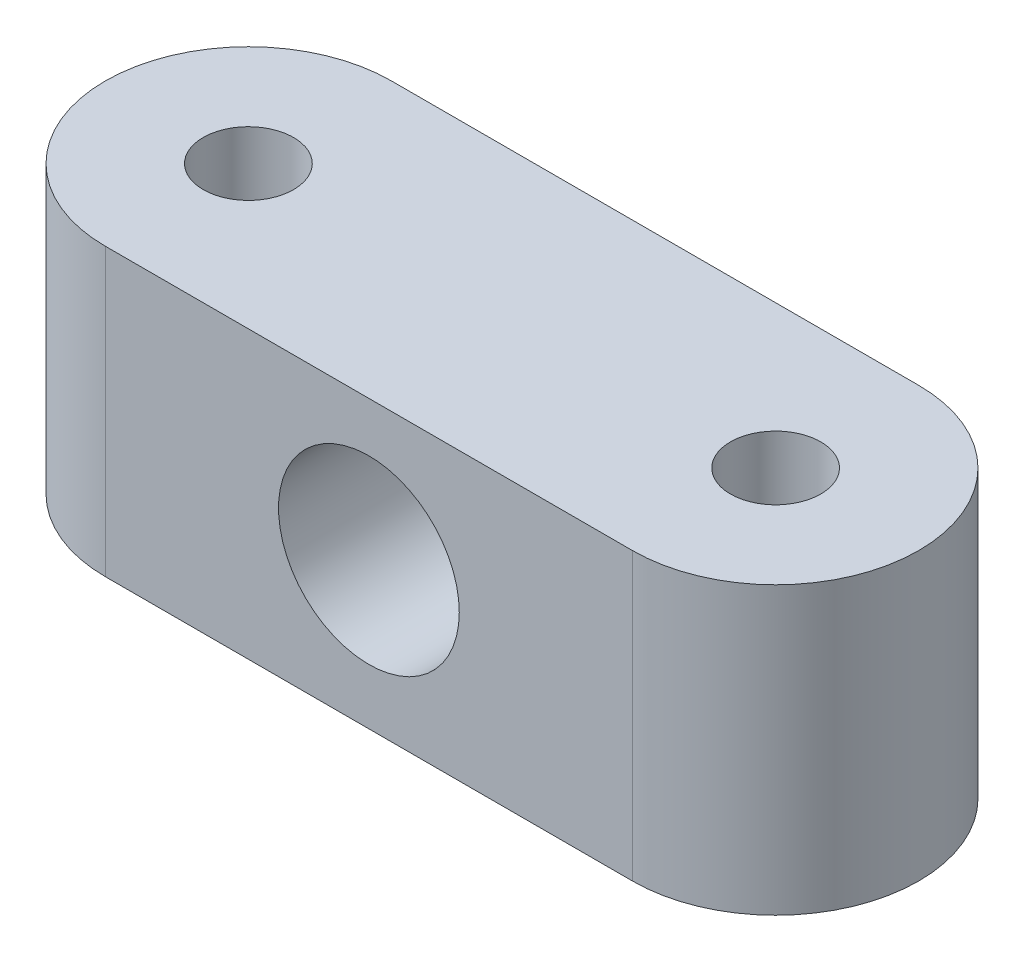
ISO-10303-21;
HEADER;
FILE_DESCRIPTION(('STEP AP214'),'2;1');
FILE_NAME('part.step','',(''),(''),'','','');
FILE_SCHEMA(('AUTOMOTIVE_DESIGN { 1 0 10303 214 1 1 1 1 }'));
ENDSEC;
DATA;
#1=APPLICATION_CONTEXT('core data for automotive mechanical design processes');
#2=APPLICATION_PROTOCOL_DEFINITION('international standard','automotive_design',2000,#1);
#3=PRODUCT_CONTEXT('',#1,'mechanical');
#4=PRODUCT('Part','Part','',(#3));
#5=PRODUCT_RELATED_PRODUCT_CATEGORY('part','',(#4));
#6=PRODUCT_DEFINITION_FORMATION('','',#4);
#7=PRODUCT_DEFINITION_CONTEXT('part definition',#1,'design');
#8=PRODUCT_DEFINITION('design','',#6,#7);
#9=PRODUCT_DEFINITION_SHAPE('','',#8);
#10=(LENGTH_UNIT() NAMED_UNIT(*) SI_UNIT(.MILLI.,.METRE.));
#11=(NAMED_UNIT(*) PLANE_ANGLE_UNIT() SI_UNIT($,.RADIAN.));
#12=(NAMED_UNIT(*) SI_UNIT($,.STERADIAN.) SOLID_ANGLE_UNIT());
#13=UNCERTAINTY_MEASURE_WITH_UNIT(LENGTH_MEASURE(1.E-05),#10,'distance_accuracy_value','');
#14=(GEOMETRIC_REPRESENTATION_CONTEXT(3) GLOBAL_UNCERTAINTY_ASSIGNED_CONTEXT((#13)) GLOBAL_UNIT_ASSIGNED_CONTEXT((#10,
#11,#12)) REPRESENTATION_CONTEXT('',''));
#15=CARTESIAN_POINT('',(0.,0.,0.));
#16=DIRECTION('',(0.,0.,1.));
#17=DIRECTION('',(1.,0.,0.));
#18=AXIS2_PLACEMENT_3D('',#15,#16,#17);
#19=CARTESIAN_POINT('',(0.,38.,0.));
#20=DIRECTION('',(0.,1.,0.));
#21=DIRECTION('',(0.,0.,1.));
#22=AXIS2_PLACEMENT_3D('',#19,#20,#21);
#23=PLANE('',#22);
#24=CARTESIAN_POINT('',(70.,38.,0.));
#25=DIRECTION('',(0.,1.,0.));
#26=DIRECTION('',(0.,0.,1.));
#27=AXIS2_PLACEMENT_3D('',#24,#25,#26);
#28=CIRCLE('',#27,6.);
#29=CARTESIAN_POINT('',(70.,38.,6.));
#30=VERTEX_POINT('',#29);
#31=EDGE_CURVE('E104',#30,#30,#28,.T.);
#32=ORIENTED_EDGE('',*,*,#31,.F.);
#33=EDGE_LOOP('',(#32));
#34=FACE_BOUND('',#33,.T.);
#35=CARTESIAN_POINT('',(0.,38.,0.));
#36=DIRECTION('',(0.,1.,0.));
#37=DIRECTION('',(0.,0.,1.));
#38=AXIS2_PLACEMENT_3D('',#35,#36,#37);
#39=CIRCLE('',#38,19.);
#40=CARTESIAN_POINT('',(0.,38.,-19.));
#41=VERTEX_POINT('',#40);
#42=CARTESIAN_POINT('',(0.,38.,19.));
#43=VERTEX_POINT('',#42);
#44=EDGE_CURVE('E89',#41,#43,#39,.T.);
#45=ORIENTED_EDGE('',*,*,#44,.T.);
#46=DIRECTION('',(1.,0.,0.));
#47=VECTOR('',#46,1.);
#48=CARTESIAN_POINT('',(0.,38.,19.));
#49=LINE('',#48,#47);
#50=CARTESIAN_POINT('',(70.,38.,19.));
#51=VERTEX_POINT('',#50);
#52=EDGE_CURVE('E84',#43,#51,#49,.T.);
#53=ORIENTED_EDGE('',*,*,#52,.T.);
#54=CARTESIAN_POINT('',(70.,38.,0.));
#55=DIRECTION('',(0.,1.,0.));
#56=DIRECTION('',(0.,0.,1.));
#57=AXIS2_PLACEMENT_3D('',#54,#55,#56);
#58=CIRCLE('',#57,19.);
#59=CARTESIAN_POINT('',(70.,38.,-19.));
#60=VERTEX_POINT('',#59);
#61=EDGE_CURVE('E87',#51,#60,#58,.T.);
#62=ORIENTED_EDGE('',*,*,#61,.T.);
#63=DIRECTION('',(-1.,0.,0.));
#64=VECTOR('',#63,1.);
#65=CARTESIAN_POINT('',(0.,38.,-19.));
#66=LINE('',#65,#64);
#67=EDGE_CURVE('E54',#60,#41,#66,.T.);
#68=ORIENTED_EDGE('',*,*,#67,.T.);
#69=EDGE_LOOP('',(#45,#53,#62,#68));
#70=FACE_BOUND('',#69,.T.);
#71=CARTESIAN_POINT('',(0.,38.,0.));
#72=DIRECTION('',(0.,1.,0.));
#73=DIRECTION('',(0.,0.,1.));
#74=AXIS2_PLACEMENT_3D('',#71,#72,#73);
#75=CIRCLE('',#74,6.);
#76=CARTESIAN_POINT('',(0.,38.,6.));
#77=VERTEX_POINT('',#76);
#78=EDGE_CURVE('E119',#77,#77,#75,.T.);
#79=ORIENTED_EDGE('',*,*,#78,.F.);
#80=EDGE_LOOP('',(#79));
#81=FACE_BOUND('',#80,.T.);
#82=ADVANCED_FACE('F37',(#34,#70,#81),#23,.T.);
#83=CARTESIAN_POINT('',(0.,0.,0.));
#84=DIRECTION('',(0.,1.,0.));
#85=DIRECTION('',(0.,0.,1.));
#86=AXIS2_PLACEMENT_3D('',#83,#84,#85);
#87=PLANE('',#86);
#88=CARTESIAN_POINT('',(0.,0.,0.));
#89=DIRECTION('',(0.,1.,0.));
#90=DIRECTION('',(0.,0.,1.));
#91=AXIS2_PLACEMENT_3D('',#88,#89,#90);
#92=CIRCLE('',#91,19.);
#93=CARTESIAN_POINT('',(0.,0.,-19.));
#94=VERTEX_POINT('',#93);
#95=CARTESIAN_POINT('',(0.,0.,19.));
#96=VERTEX_POINT('',#95);
#97=EDGE_CURVE('E101',#94,#96,#92,.T.);
#98=ORIENTED_EDGE('',*,*,#97,.F.);
#99=DIRECTION('',(-1.,0.,0.));
#100=VECTOR('',#99,1.);
#101=CARTESIAN_POINT('',(0.,0.,-19.));
#102=LINE('',#101,#100);
#103=CARTESIAN_POINT('',(70.,0.,-19.));
#104=VERTEX_POINT('',#103);
#105=EDGE_CURVE('E77',#104,#94,#102,.T.);
#106=ORIENTED_EDGE('',*,*,#105,.F.);
#107=CARTESIAN_POINT('',(70.,0.,0.));
#108=DIRECTION('',(0.,1.,0.));
#109=DIRECTION('',(0.,0.,1.));
#110=AXIS2_PLACEMENT_3D('',#107,#108,#109);
#111=CIRCLE('',#110,19.);
#112=CARTESIAN_POINT('',(70.,0.,19.));
#113=VERTEX_POINT('',#112);
#114=EDGE_CURVE('E71',#113,#104,#111,.T.);
#115=ORIENTED_EDGE('',*,*,#114,.F.);
#116=DIRECTION('',(1.,0.,0.));
#117=VECTOR('',#116,1.);
#118=CARTESIAN_POINT('',(0.,0.,19.));
#119=LINE('',#118,#117);
#120=EDGE_CURVE('E93',#96,#113,#119,.T.);
#121=ORIENTED_EDGE('',*,*,#120,.F.);
#122=EDGE_LOOP('',(#98,#106,#115,#121));
#123=FACE_BOUND('',#122,.T.);
#124=CARTESIAN_POINT('',(70.,0.,0.));
#125=DIRECTION('',(0.,1.,0.));
#126=DIRECTION('',(0.,0.,1.));
#127=AXIS2_PLACEMENT_3D('',#124,#125,#126);
#128=CIRCLE('',#127,6.);
#129=CARTESIAN_POINT('',(70.,0.,6.));
#130=VERTEX_POINT('',#129);
#131=EDGE_CURVE('E116',#130,#130,#128,.T.);
#132=ORIENTED_EDGE('',*,*,#131,.T.);
#133=EDGE_LOOP('',(#132));
#134=FACE_BOUND('',#133,.T.);
#135=CARTESIAN_POINT('',(0.,0.,0.));
#136=DIRECTION('',(0.,1.,0.));
#137=DIRECTION('',(0.,0.,1.));
#138=AXIS2_PLACEMENT_3D('',#135,#136,#137);
#139=CIRCLE('',#138,6.);
#140=CARTESIAN_POINT('',(0.,0.,6.));
#141=VERTEX_POINT('',#140);
#142=EDGE_CURVE('E122',#141,#141,#139,.T.);
#143=ORIENTED_EDGE('',*,*,#142,.T.);
#144=EDGE_LOOP('',(#143));
#145=FACE_BOUND('',#144,.T.);
#146=ADVANCED_FACE('F112',(#123,#134,#145),#87,.F.);
#147=CARTESIAN_POINT('',(0.,38.,0.));
#148=DIRECTION('',(0.,-1.,0.));
#149=DIRECTION('',(0.,0.,-1.));
#150=AXIS2_PLACEMENT_3D('',#147,#148,#149);
#151=CYLINDRICAL_SURFACE('',#150,19.);
#152=ORIENTED_EDGE('',*,*,#97,.T.);
#153=DIRECTION('',(0.,-1.,0.));
#154=VECTOR('',#153,1.);
#155=CARTESIAN_POINT('',(0.,38.,19.));
#156=LINE('',#155,#154);
#157=EDGE_CURVE('E11',#43,#96,#156,.T.);
#158=ORIENTED_EDGE('',*,*,#157,.F.);
#159=ORIENTED_EDGE('',*,*,#44,.F.);
#160=DIRECTION('',(0.,-1.,0.));
#161=VECTOR('',#160,1.);
#162=CARTESIAN_POINT('',(0.,38.,-19.));
#163=LINE('',#162,#161);
#164=EDGE_CURVE('E97',#41,#94,#163,.T.);
#165=ORIENTED_EDGE('',*,*,#164,.T.);
#166=EDGE_LOOP('',(#152,#158,#159,#165));
#167=FACE_BOUND('',#166,.T.);
#168=ADVANCED_FACE('F39',(#167),#151,.T.);
#169=CARTESIAN_POINT('',(0.,38.,19.));
#170=DIRECTION('',(0.,0.,-1.));
#171=DIRECTION('',(-1.,0.,0.));
#172=AXIS2_PLACEMENT_3D('',#169,#170,#171);
#173=PLANE('',#172);
#174=CARTESIAN_POINT('',(35.,19.4026178855878,19.));
#175=DIRECTION('',(0.,0.,1.));
#176=DIRECTION('',(1.,0.,0.));
#177=AXIS2_PLACEMENT_3D('',#174,#175,#176);
#178=CIRCLE('',#177,12.);
#179=CARTESIAN_POINT('',(47.,19.4026178855878,19.));
#180=VERTEX_POINT('',#179);
#181=EDGE_CURVE('E128',#180,#180,#178,.T.);
#182=ORIENTED_EDGE('',*,*,#181,.F.);
#183=EDGE_LOOP('',(#182));
#184=FACE_BOUND('',#183,.T.);
#185=ORIENTED_EDGE('',*,*,#120,.T.);
#186=DIRECTION('',(0.,-1.,0.));
#187=VECTOR('',#186,1.);
#188=CARTESIAN_POINT('',(70.,38.,19.));
#189=LINE('',#188,#187);
#190=EDGE_CURVE('E46',#51,#113,#189,.T.);
#191=ORIENTED_EDGE('',*,*,#190,.F.);
#192=ORIENTED_EDGE('',*,*,#52,.F.);
#193=ORIENTED_EDGE('',*,*,#157,.T.);
#194=EDGE_LOOP('',(#185,#191,#192,#193));
#195=FACE_BOUND('',#194,.T.);
#196=ADVANCED_FACE('F92',(#184,#195),#173,.F.);
#197=CARTESIAN_POINT('',(70.,38.,0.));
#198=DIRECTION('',(0.,-1.,0.));
#199=DIRECTION('',(0.,0.,-1.));
#200=AXIS2_PLACEMENT_3D('',#197,#198,#199);
#201=CYLINDRICAL_SURFACE('',#200,19.);
#202=ORIENTED_EDGE('',*,*,#114,.T.);
#203=DIRECTION('',(0.,-1.,0.));
#204=VECTOR('',#203,1.);
#205=CARTESIAN_POINT('',(70.,38.,-19.));
#206=LINE('',#205,#204);
#207=EDGE_CURVE('E94',#60,#104,#206,.T.);
#208=ORIENTED_EDGE('',*,*,#207,.F.);
#209=ORIENTED_EDGE('',*,*,#61,.F.);
#210=ORIENTED_EDGE('',*,*,#190,.T.);
#211=EDGE_LOOP('',(#202,#208,#209,#210));
#212=FACE_BOUND('',#211,.T.);
#213=ADVANCED_FACE('F95',(#212),#201,.T.);
#214=CARTESIAN_POINT('',(0.,38.,-19.));
#215=DIRECTION('',(0.,0.,1.));
#216=DIRECTION('',(1.,0.,0.));
#217=AXIS2_PLACEMENT_3D('',#214,#215,#216);
#218=PLANE('',#217);
#219=CARTESIAN_POINT('',(35.,19.4026178855878,-19.));
#220=DIRECTION('',(0.,0.,1.));
#221=DIRECTION('',(1.,0.,0.));
#222=AXIS2_PLACEMENT_3D('',#219,#220,#221);
#223=CIRCLE('',#222,12.);
#224=CARTESIAN_POINT('',(47.,19.4026178855878,-19.));
#225=VERTEX_POINT('',#224);
#226=EDGE_CURVE('E125',#225,#225,#223,.T.);
#227=ORIENTED_EDGE('',*,*,#226,.T.);
#228=EDGE_LOOP('',(#227));
#229=FACE_BOUND('',#228,.T.);
#230=ORIENTED_EDGE('',*,*,#105,.T.);
#231=ORIENTED_EDGE('',*,*,#164,.F.);
#232=ORIENTED_EDGE('',*,*,#67,.F.);
#233=ORIENTED_EDGE('',*,*,#207,.T.);
#234=EDGE_LOOP('',(#230,#231,#232,#233));
#235=FACE_BOUND('',#234,.T.);
#236=ADVANCED_FACE('F109',(#229,#235),#218,.F.);
#237=CARTESIAN_POINT('',(70.,38.,0.));
#238=DIRECTION('',(0.,-1.,0.));
#239=DIRECTION('',(0.,0.,-1.));
#240=AXIS2_PLACEMENT_3D('',#237,#238,#239);
#241=CYLINDRICAL_SURFACE('',#240,6.);
#242=ORIENTED_EDGE('',*,*,#31,.T.);
#243=EDGE_LOOP('',(#242));
#244=FACE_BOUND('',#243,.T.);
#245=ORIENTED_EDGE('',*,*,#131,.F.);
#246=EDGE_LOOP('',(#245));
#247=FACE_BOUND('',#246,.T.);
#248=ADVANCED_FACE('F157',(#244,#247),#241,.F.);
#249=CARTESIAN_POINT('',(0.,38.,0.));
#250=DIRECTION('',(0.,-1.,0.));
#251=DIRECTION('',(0.,0.,-1.));
#252=AXIS2_PLACEMENT_3D('',#249,#250,#251);
#253=CYLINDRICAL_SURFACE('',#252,6.);
#254=ORIENTED_EDGE('',*,*,#78,.T.);
#255=EDGE_LOOP('',(#254));
#256=FACE_BOUND('',#255,.T.);
#257=ORIENTED_EDGE('',*,*,#142,.F.);
#258=EDGE_LOOP('',(#257));
#259=FACE_BOUND('',#258,.T.);
#260=ADVANCED_FACE('F138',(#256,#259),#253,.F.);
#261=CARTESIAN_POINT('',(35.,19.4026178855878,-19.));
#262=DIRECTION('',(0.,0.,1.));
#263=DIRECTION('',(1.,0.,0.));
#264=AXIS2_PLACEMENT_3D('',#261,#262,#263);
#265=CYLINDRICAL_SURFACE('',#264,12.);
#266=ORIENTED_EDGE('',*,*,#226,.F.);
#267=EDGE_LOOP('',(#266));
#268=FACE_BOUND('',#267,.T.);
#269=ORIENTED_EDGE('',*,*,#181,.T.);
#270=EDGE_LOOP('',(#269));
#271=FACE_BOUND('',#270,.T.);
#272=ADVANCED_FACE('F135',(#268,#271),#265,.F.);
#273=CLOSED_SHELL('',(#82,#146,#168,#196,#213,#236,#248,#260,#272));
#274=MANIFOLD_SOLID_BREP('B2',#273);
#275=ADVANCED_BREP_SHAPE_REPRESENTATION('',(#18,#274),#14);
#276=SHAPE_DEFINITION_REPRESENTATION(#9,#275);
ENDSEC;
END-ISO-10303-21;
